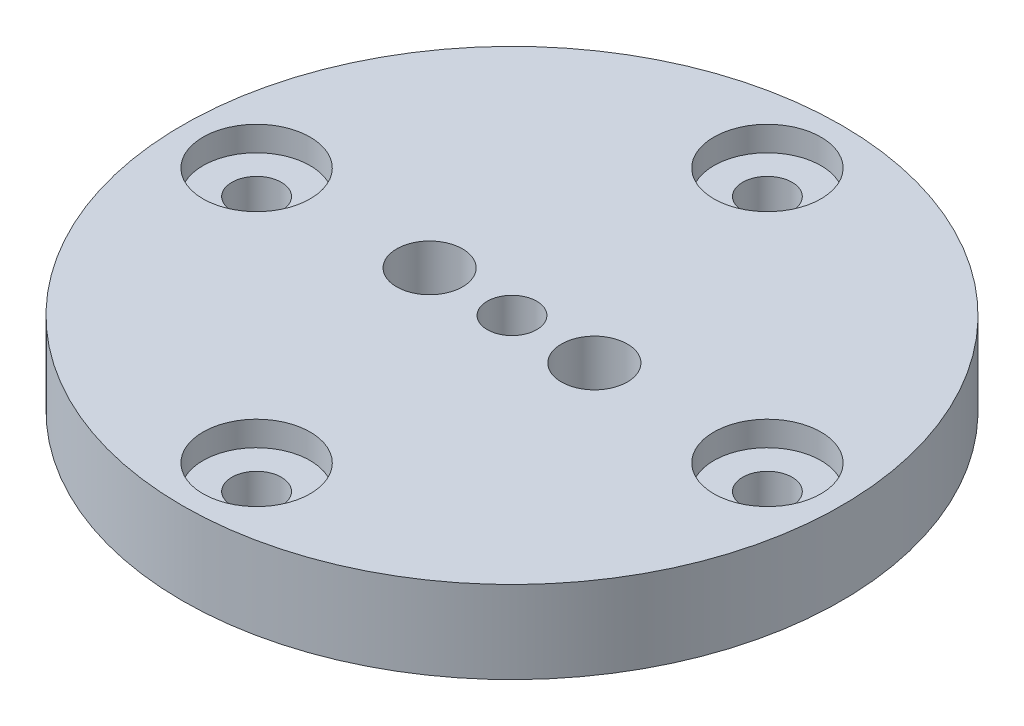
ISO-10303-21;
HEADER;
FILE_DESCRIPTION(('STEP AP214'),'2;1');
FILE_NAME('part.step','',(''),(''),'','','');
FILE_SCHEMA(('AUTOMOTIVE_DESIGN { 1 0 10303 214 1 1 1 1 }'));
ENDSEC;
DATA;
#1=APPLICATION_CONTEXT('core data for automotive mechanical design processes');
#2=APPLICATION_PROTOCOL_DEFINITION('international standard','automotive_design',2000,#1);
#3=PRODUCT_CONTEXT('',#1,'mechanical');
#4=PRODUCT('Part','Part','',(#3));
#5=PRODUCT_RELATED_PRODUCT_CATEGORY('part','',(#4));
#6=PRODUCT_DEFINITION_FORMATION('','',#4);
#7=PRODUCT_DEFINITION_CONTEXT('part definition',#1,'design');
#8=PRODUCT_DEFINITION('design','',#6,#7);
#9=PRODUCT_DEFINITION_SHAPE('','',#8);
#10=(LENGTH_UNIT() NAMED_UNIT(*) SI_UNIT(.MILLI.,.METRE.));
#11=(NAMED_UNIT(*) PLANE_ANGLE_UNIT() SI_UNIT($,.RADIAN.));
#12=(NAMED_UNIT(*) SI_UNIT($,.STERADIAN.) SOLID_ANGLE_UNIT());
#13=UNCERTAINTY_MEASURE_WITH_UNIT(LENGTH_MEASURE(1.E-05),#10,'distance_accuracy_value','');
#14=(GEOMETRIC_REPRESENTATION_CONTEXT(3) GLOBAL_UNCERTAINTY_ASSIGNED_CONTEXT((#13)) GLOBAL_UNIT_ASSIGNED_CONTEXT((#10,
#11,#12)) REPRESENTATION_CONTEXT('',''));
#15=CARTESIAN_POINT('',(0.,0.,0.));
#16=DIRECTION('',(0.,0.,1.));
#17=DIRECTION('',(1.,0.,0.));
#18=AXIS2_PLACEMENT_3D('',#15,#16,#17);
#19=CARTESIAN_POINT('',(0.,5.,-15.5));
#20=DIRECTION('',(0.,-1.,0.));
#21=DIRECTION('',(0.,0.,-1.));
#22=AXIS2_PLACEMENT_3D('',#19,#20,#21);
#23=CYLINDRICAL_SURFACE('',#22,1.5);
#24=CARTESIAN_POINT('',(0.,0.,-15.5));
#25=DIRECTION('',(0.,1.,0.));
#26=DIRECTION('',(0.,0.,1.));
#27=AXIS2_PLACEMENT_3D('',#24,#25,#26);
#28=CIRCLE('',#27,1.5);
#29=CARTESIAN_POINT('',(0.,0.,-14.));
#30=VERTEX_POINT('',#29);
#31=EDGE_CURVE('E44',#30,#30,#28,.T.);
#32=ORIENTED_EDGE('',*,*,#31,.F.);
#33=EDGE_LOOP('',(#32));
#34=FACE_BOUND('',#33,.T.);
#35=CARTESIAN_POINT('',(0.,3.5,-15.5));
#36=DIRECTION('',(0.,1.,0.));
#37=DIRECTION('',(0.,0.,1.));
#38=AXIS2_PLACEMENT_3D('',#35,#36,#37);
#39=CIRCLE('',#38,1.5);
#40=CARTESIAN_POINT('',(0.,3.5,-14.));
#41=VERTEX_POINT('',#40);
#42=EDGE_CURVE('E35',#41,#41,#39,.T.);
#43=ORIENTED_EDGE('',*,*,#42,.T.);
#44=EDGE_LOOP('',(#43));
#45=FACE_BOUND('',#44,.T.);
#46=ADVANCED_FACE('F31',(#34,#45),#23,.F.);
#47=CARTESIAN_POINT('',(15.5000000000004,5.,-4.37689192363245E-13));
#48=DIRECTION('',(0.,-1.,0.));
#49=DIRECTION('',(0.,0.,-1.));
#50=AXIS2_PLACEMENT_3D('',#47,#48,#49);
#51=CYLINDRICAL_SURFACE('',#50,1.50000000000034);
#52=CARTESIAN_POINT('',(15.5000000000004,0.,-4.37689192363245E-13));
#53=DIRECTION('',(0.,1.,0.));
#54=DIRECTION('',(0.,0.,1.));
#55=AXIS2_PLACEMENT_3D('',#52,#53,#54);
#56=CIRCLE('',#55,1.50000000000034);
#57=CARTESIAN_POINT('',(15.5000000000004,0.,1.49999999999991));
#58=VERTEX_POINT('',#57);
#59=EDGE_CURVE('E89',#58,#58,#56,.T.);
#60=ORIENTED_EDGE('',*,*,#59,.F.);
#61=EDGE_LOOP('',(#60));
#62=FACE_BOUND('',#61,.T.);
#63=CARTESIAN_POINT('',(15.5000000000004,3.5,-4.37689192363245E-13));
#64=DIRECTION('',(0.,1.,0.));
#65=DIRECTION('',(0.,0.,1.));
#66=AXIS2_PLACEMENT_3D('',#63,#64,#65);
#67=CIRCLE('',#66,1.50000000000034);
#68=CARTESIAN_POINT('',(15.5000000000004,3.5,1.49999999999991));
#69=VERTEX_POINT('',#68);
#70=EDGE_CURVE('E55',#69,#69,#67,.T.);
#71=ORIENTED_EDGE('',*,*,#70,.T.);
#72=EDGE_LOOP('',(#71));
#73=FACE_BOUND('',#72,.T.);
#74=ADVANCED_FACE('F99',(#62,#73),#51,.F.);
#75=CARTESIAN_POINT('',(8.75378384726489E-13,5.,15.5));
#76=DIRECTION('',(0.,-1.,0.));
#77=DIRECTION('',(0.,0.,-1.));
#78=AXIS2_PLACEMENT_3D('',#75,#76,#77);
#79=CYLINDRICAL_SURFACE('',#78,1.50000000000094);
#80=CARTESIAN_POINT('',(8.75378384726489E-13,0.,15.5));
#81=DIRECTION('',(0.,1.,0.));
#82=DIRECTION('',(0.,0.,1.));
#83=AXIS2_PLACEMENT_3D('',#80,#81,#82);
#84=CIRCLE('',#83,1.50000000000094);
#85=CARTESIAN_POINT('',(8.75378384726489E-13,0.,17.0000000000009));
#86=VERTEX_POINT('',#85);
#87=EDGE_CURVE('E87',#86,#86,#84,.T.);
#88=ORIENTED_EDGE('',*,*,#87,.F.);
#89=EDGE_LOOP('',(#88));
#90=FACE_BOUND('',#89,.T.);
#91=CARTESIAN_POINT('',(8.75378384726489E-13,3.5,15.5));
#92=DIRECTION('',(0.,1.,0.));
#93=DIRECTION('',(0.,0.,1.));
#94=AXIS2_PLACEMENT_3D('',#91,#92,#93);
#95=CIRCLE('',#94,1.50000000000094);
#96=CARTESIAN_POINT('',(8.75378384726489E-13,3.5,17.0000000000009));
#97=VERTEX_POINT('',#96);
#98=EDGE_CURVE('E52',#97,#97,#95,.T.);
#99=ORIENTED_EDGE('',*,*,#98,.T.);
#100=EDGE_LOOP('',(#99));
#101=FACE_BOUND('',#100,.T.);
#102=ADVANCED_FACE('F105',(#90,#101),#79,.F.);
#103=CARTESIAN_POINT('',(-15.4999999999996,5.,4.39587394901923E-13));
#104=DIRECTION('',(0.,-1.,0.));
#105=DIRECTION('',(0.,0.,-1.));
#106=AXIS2_PLACEMENT_3D('',#103,#104,#105);
#107=CYLINDRICAL_SURFACE('',#106,1.5000000000007);
#108=CARTESIAN_POINT('',(-15.4999999999996,0.,4.39587394901923E-13));
#109=DIRECTION('',(0.,1.,0.));
#110=DIRECTION('',(0.,0.,1.));
#111=AXIS2_PLACEMENT_3D('',#108,#109,#110);
#112=CIRCLE('',#111,1.5000000000007);
#113=CARTESIAN_POINT('',(-15.4999999999996,0.,1.50000000000114));
#114=VERTEX_POINT('',#113);
#115=EDGE_CURVE('E82',#114,#114,#112,.T.);
#116=ORIENTED_EDGE('',*,*,#115,.F.);
#117=EDGE_LOOP('',(#116));
#118=FACE_BOUND('',#117,.T.);
#119=CARTESIAN_POINT('',(-15.4999999999996,3.5,4.39587394901923E-13));
#120=DIRECTION('',(0.,1.,0.));
#121=DIRECTION('',(0.,0.,1.));
#122=AXIS2_PLACEMENT_3D('',#119,#120,#121);
#123=CIRCLE('',#122,1.5000000000007);
#124=CARTESIAN_POINT('',(-15.4999999999996,3.5,1.50000000000114));
#125=VERTEX_POINT('',#124);
#126=EDGE_CURVE('E49',#125,#125,#123,.T.);
#127=ORIENTED_EDGE('',*,*,#126,.T.);
#128=EDGE_LOOP('',(#127));
#129=FACE_BOUND('',#128,.T.);
#130=ADVANCED_FACE('F112',(#118,#129),#107,.F.);
#131=CARTESIAN_POINT('',(0.,5.,0.));
#132=DIRECTION('',(0.,1.,0.));
#133=DIRECTION('',(0.,0.,1.));
#134=AXIS2_PLACEMENT_3D('',#131,#132,#133);
#135=PLANE('',#134);
#136=CARTESIAN_POINT('',(0.,5.,-15.5000000000004));
#137=DIRECTION('',(0.,1.,0.));
#138=DIRECTION('',(0.,0.,1.));
#139=AXIS2_PLACEMENT_3D('',#136,#137,#138);
#140=CIRCLE('',#139,3.25);
#141=CARTESIAN_POINT('',(0.,5.,-12.2500000000004));
#142=VERTEX_POINT('',#141);
#143=EDGE_CURVE('E217',#142,#142,#140,.T.);
#144=ORIENTED_EDGE('',*,*,#143,.F.);
#145=EDGE_LOOP('',(#144));
#146=FACE_BOUND('',#145,.T.);
#147=CARTESIAN_POINT('',(15.5000000000009,5.,-4.37689192363257E-13));
#148=DIRECTION('',(0.,1.,0.));
#149=DIRECTION('',(0.,0.,1.));
#150=AXIS2_PLACEMENT_3D('',#147,#148,#149);
#151=CIRCLE('',#150,3.25000000000034);
#152=CARTESIAN_POINT('',(15.5000000000009,5.,3.2499999999999));
#153=VERTEX_POINT('',#152);
#154=EDGE_CURVE('E159',#153,#153,#151,.T.);
#155=ORIENTED_EDGE('',*,*,#154,.F.);
#156=EDGE_LOOP('',(#155));
#157=FACE_BOUND('',#156,.T.);
#158=CARTESIAN_POINT('',(8.75378384726514E-13,5.,15.5000000000004));
#159=DIRECTION('',(0.,1.,0.));
#160=DIRECTION('',(0.,0.,1.));
#161=AXIS2_PLACEMENT_3D('',#158,#159,#160);
#162=CIRCLE('',#161,3.25000000000094);
#163=CARTESIAN_POINT('',(8.75378384726514E-13,5.,18.7500000000014));
#164=VERTEX_POINT('',#163);
#165=EDGE_CURVE('E160',#164,#164,#162,.T.);
#166=ORIENTED_EDGE('',*,*,#165,.F.);
#167=EDGE_LOOP('',(#166));
#168=FACE_BOUND('',#167,.T.);
#169=CARTESIAN_POINT('',(-15.5,5.,4.39587394901935E-13));
#170=DIRECTION('',(0.,1.,0.));
#171=DIRECTION('',(0.,0.,1.));
#172=AXIS2_PLACEMENT_3D('',#169,#170,#171);
#173=CIRCLE('',#172,3.2500000000007);
#174=CARTESIAN_POINT('',(-15.5,5.,3.25000000000114));
#175=VERTEX_POINT('',#174);
#176=EDGE_CURVE('E171',#175,#175,#173,.T.);
#177=ORIENTED_EDGE('',*,*,#176,.F.);
#178=EDGE_LOOP('',(#177));
#179=FACE_BOUND('',#178,.T.);
#180=CARTESIAN_POINT('',(5.,5.,0.));
#181=DIRECTION('',(0.,1.,0.));
#182=DIRECTION('',(0.,0.,1.));
#183=AXIS2_PLACEMENT_3D('',#180,#181,#182);
#184=CIRCLE('',#183,2.);
#185=CARTESIAN_POINT('',(5.,5.,2.));
#186=VERTEX_POINT('',#185);
#187=EDGE_CURVE('E73',#186,#186,#184,.T.);
#188=ORIENTED_EDGE('',*,*,#187,.F.);
#189=EDGE_LOOP('',(#188));
#190=FACE_BOUND('',#189,.T.);
#191=CARTESIAN_POINT('',(0.,5.,0.));
#192=DIRECTION('',(0.,1.,0.));
#193=DIRECTION('',(0.,0.,1.));
#194=AXIS2_PLACEMENT_3D('',#191,#192,#193);
#195=CIRCLE('',#194,20.);
#196=CARTESIAN_POINT('',(0.,5.,20.));
#197=VERTEX_POINT('',#196);
#198=EDGE_CURVE('E10',#197,#197,#195,.T.);
#199=ORIENTED_EDGE('',*,*,#198,.T.);
#200=EDGE_LOOP('',(#199));
#201=FACE_BOUND('',#200,.T.);
#202=CARTESIAN_POINT('',(-5.,5.,0.));
#203=DIRECTION('',(0.,1.,0.));
#204=DIRECTION('',(0.,0.,1.));
#205=AXIS2_PLACEMENT_3D('',#202,#203,#204);
#206=CIRCLE('',#205,2.);
#207=CARTESIAN_POINT('',(-5.,5.,2.));
#208=VERTEX_POINT('',#207);
#209=EDGE_CURVE('E79',#208,#208,#206,.T.);
#210=ORIENTED_EDGE('',*,*,#209,.F.);
#211=EDGE_LOOP('',(#210));
#212=FACE_BOUND('',#211,.T.);
#213=CARTESIAN_POINT('',(0.,5.,0.));
#214=DIRECTION('',(0.,1.,0.));
#215=DIRECTION('',(0.,0.,1.));
#216=AXIS2_PLACEMENT_3D('',#213,#214,#215);
#217=CIRCLE('',#216,1.5);
#218=CARTESIAN_POINT('',(0.,5.,1.5));
#219=VERTEX_POINT('',#218);
#220=EDGE_CURVE('E64',#219,#219,#217,.T.);
#221=ORIENTED_EDGE('',*,*,#220,.F.);
#222=EDGE_LOOP('',(#221));
#223=FACE_BOUND('',#222,.T.);
#224=ADVANCED_FACE('F110',(#146,#157,#168,#179,#190,#201,#212,#223),#135,.T.);
#225=CARTESIAN_POINT('',(0.,0.,0.));
#226=DIRECTION('',(0.,1.,0.));
#227=DIRECTION('',(0.,0.,1.));
#228=AXIS2_PLACEMENT_3D('',#225,#226,#227);
#229=PLANE('',#228);
#230=CARTESIAN_POINT('',(0.,0.,0.));
#231=DIRECTION('',(0.,1.,0.));
#232=DIRECTION('',(0.,0.,1.));
#233=AXIS2_PLACEMENT_3D('',#230,#231,#232);
#234=CIRCLE('',#233,20.);
#235=CARTESIAN_POINT('',(0.,0.,20.));
#236=VERTEX_POINT('',#235);
#237=EDGE_CURVE('E39',#236,#236,#234,.T.);
#238=ORIENTED_EDGE('',*,*,#237,.F.);
#239=EDGE_LOOP('',(#238));
#240=FACE_BOUND('',#239,.T.);
#241=ORIENTED_EDGE('',*,*,#31,.T.);
#242=EDGE_LOOP('',(#241));
#243=FACE_BOUND('',#242,.T.);
#244=ORIENTED_EDGE('',*,*,#59,.T.);
#245=EDGE_LOOP('',(#244));
#246=FACE_BOUND('',#245,.T.);
#247=ORIENTED_EDGE('',*,*,#87,.T.);
#248=EDGE_LOOP('',(#247));
#249=FACE_BOUND('',#248,.T.);
#250=ORIENTED_EDGE('',*,*,#115,.T.);
#251=EDGE_LOOP('',(#250));
#252=FACE_BOUND('',#251,.T.);
#253=CARTESIAN_POINT('',(-5.,0.,0.));
#254=DIRECTION('',(0.,1.,0.));
#255=DIRECTION('',(0.,0.,1.));
#256=AXIS2_PLACEMENT_3D('',#253,#254,#255);
#257=CIRCLE('',#256,2.);
#258=CARTESIAN_POINT('',(-5.,0.,2.));
#259=VERTEX_POINT('',#258);
#260=EDGE_CURVE('E76',#259,#259,#257,.T.);
#261=ORIENTED_EDGE('',*,*,#260,.T.);
#262=EDGE_LOOP('',(#261));
#263=FACE_BOUND('',#262,.T.);
#264=CARTESIAN_POINT('',(5.,0.,0.));
#265=DIRECTION('',(0.,1.,0.));
#266=DIRECTION('',(0.,0.,1.));
#267=AXIS2_PLACEMENT_3D('',#264,#265,#266);
#268=CIRCLE('',#267,2.);
#269=CARTESIAN_POINT('',(5.,0.,2.));
#270=VERTEX_POINT('',#269);
#271=EDGE_CURVE('E69',#270,#270,#268,.T.);
#272=ORIENTED_EDGE('',*,*,#271,.T.);
#273=EDGE_LOOP('',(#272));
#274=FACE_BOUND('',#273,.T.);
#275=CARTESIAN_POINT('',(0.,0.,0.));
#276=DIRECTION('',(0.,1.,0.));
#277=DIRECTION('',(0.,0.,1.));
#278=AXIS2_PLACEMENT_3D('',#275,#276,#277);
#279=CIRCLE('',#278,1.5);
#280=CARTESIAN_POINT('',(0.,0.,1.5));
#281=VERTEX_POINT('',#280);
#282=EDGE_CURVE('E60',#281,#281,#279,.T.);
#283=ORIENTED_EDGE('',*,*,#282,.T.);
#284=EDGE_LOOP('',(#283));
#285=FACE_BOUND('',#284,.T.);
#286=ADVANCED_FACE('F96',(#240,#243,#246,#249,#252,#263,#274,#285),#229,.F.);
#287=CARTESIAN_POINT('',(0.,5.,0.));
#288=DIRECTION('',(0.,-1.,0.));
#289=DIRECTION('',(0.,0.,-1.));
#290=AXIS2_PLACEMENT_3D('',#287,#288,#289);
#291=CYLINDRICAL_SURFACE('',#290,20.);
#292=ORIENTED_EDGE('',*,*,#198,.F.);
#293=EDGE_LOOP('',(#292));
#294=FACE_BOUND('',#293,.T.);
#295=ORIENTED_EDGE('',*,*,#237,.T.);
#296=EDGE_LOOP('',(#295));
#297=FACE_BOUND('',#296,.T.);
#298=ADVANCED_FACE('F33',(#294,#297),#291,.T.);
#299=CARTESIAN_POINT('',(-5.,5.,0.));
#300=DIRECTION('',(0.,-1.,0.));
#301=DIRECTION('',(0.,0.,-1.));
#302=AXIS2_PLACEMENT_3D('',#299,#300,#301);
#303=CYLINDRICAL_SURFACE('',#302,2.);
#304=ORIENTED_EDGE('',*,*,#209,.T.);
#305=EDGE_LOOP('',(#304));
#306=FACE_BOUND('',#305,.T.);
#307=ORIENTED_EDGE('',*,*,#260,.F.);
#308=EDGE_LOOP('',(#307));
#309=FACE_BOUND('',#308,.T.);
#310=ADVANCED_FACE('F120',(#306,#309),#303,.F.);
#311=CARTESIAN_POINT('',(5.,5.,0.));
#312=DIRECTION('',(0.,-1.,0.));
#313=DIRECTION('',(0.,0.,-1.));
#314=AXIS2_PLACEMENT_3D('',#311,#312,#313);
#315=CYLINDRICAL_SURFACE('',#314,2.);
#316=ORIENTED_EDGE('',*,*,#187,.T.);
#317=EDGE_LOOP('',(#316));
#318=FACE_BOUND('',#317,.T.);
#319=ORIENTED_EDGE('',*,*,#271,.F.);
#320=EDGE_LOOP('',(#319));
#321=FACE_BOUND('',#320,.T.);
#322=ADVANCED_FACE('F127',(#318,#321),#315,.F.);
#323=CARTESIAN_POINT('',(0.,5.,0.));
#324=DIRECTION('',(0.,-1.,0.));
#325=DIRECTION('',(0.,0.,-1.));
#326=AXIS2_PLACEMENT_3D('',#323,#324,#325);
#327=CYLINDRICAL_SURFACE('',#326,1.5);
#328=ORIENTED_EDGE('',*,*,#220,.T.);
#329=EDGE_LOOP('',(#328));
#330=FACE_BOUND('',#329,.T.);
#331=ORIENTED_EDGE('',*,*,#282,.F.);
#332=EDGE_LOOP('',(#331));
#333=FACE_BOUND('',#332,.T.);
#334=ADVANCED_FACE('F133',(#330,#333),#327,.F.);
#335=CARTESIAN_POINT('',(-15.5,3.5,4.39587394901935E-13));
#336=DIRECTION('',(0.,1.,0.));
#337=DIRECTION('',(0.,0.,1.));
#338=AXIS2_PLACEMENT_3D('',#335,#336,#337);
#339=CYLINDRICAL_SURFACE('',#338,3.2500000000007);
#340=CARTESIAN_POINT('',(-15.5,3.5,4.39587394901935E-13));
#341=DIRECTION('',(0.,1.,0.));
#342=DIRECTION('',(0.,0.,1.));
#343=AXIS2_PLACEMENT_3D('',#340,#341,#342);
#344=CIRCLE('',#343,3.2500000000007);
#345=CARTESIAN_POINT('',(-15.5,3.5,3.25000000000114));
#346=VERTEX_POINT('',#345);
#347=EDGE_CURVE('E166',#346,#346,#344,.T.);
#348=ORIENTED_EDGE('',*,*,#347,.F.);
#349=EDGE_LOOP('',(#348));
#350=FACE_BOUND('',#349,.T.);
#351=ORIENTED_EDGE('',*,*,#176,.T.);
#352=EDGE_LOOP('',(#351));
#353=FACE_BOUND('',#352,.T.);
#354=ADVANCED_FACE('F175',(#350,#353),#339,.F.);
#355=CARTESIAN_POINT('',(-15.5,3.5,4.39587394901935E-13));
#356=DIRECTION('',(0.,1.,0.));
#357=DIRECTION('',(0.,0.,1.));
#358=AXIS2_PLACEMENT_3D('',#355,#356,#357);
#359=PLANE('',#358);
#360=ORIENTED_EDGE('',*,*,#126,.F.);
#361=EDGE_LOOP('',(#360));
#362=FACE_BOUND('',#361,.T.);
#363=ORIENTED_EDGE('',*,*,#347,.T.);
#364=EDGE_LOOP('',(#363));
#365=FACE_BOUND('',#364,.T.);
#366=ADVANCED_FACE('F189',(#362,#365),#359,.T.);
#367=CARTESIAN_POINT('',(8.75378384726514E-13,3.5,15.5000000000004));
#368=DIRECTION('',(0.,1.,0.));
#369=DIRECTION('',(0.,0.,1.));
#370=AXIS2_PLACEMENT_3D('',#367,#368,#369);
#371=CYLINDRICAL_SURFACE('',#370,3.25000000000094);
#372=CARTESIAN_POINT('',(8.75378384726514E-13,3.5,15.5000000000004));
#373=DIRECTION('',(0.,1.,0.));
#374=DIRECTION('',(0.,0.,1.));
#375=AXIS2_PLACEMENT_3D('',#372,#373,#374);
#376=CIRCLE('',#375,3.25000000000094);
#377=CARTESIAN_POINT('',(8.75378384726514E-13,3.5,18.7500000000014));
#378=VERTEX_POINT('',#377);
#379=EDGE_CURVE('E157',#378,#378,#376,.T.);
#380=ORIENTED_EDGE('',*,*,#379,.F.);
#381=EDGE_LOOP('',(#380));
#382=FACE_BOUND('',#381,.T.);
#383=ORIENTED_EDGE('',*,*,#165,.T.);
#384=EDGE_LOOP('',(#383));
#385=FACE_BOUND('',#384,.T.);
#386=ADVANCED_FACE('F153',(#382,#385),#371,.F.);
#387=CARTESIAN_POINT('',(8.75378384726514E-13,3.5,15.5000000000004));
#388=DIRECTION('',(0.,1.,0.));
#389=DIRECTION('',(0.,0.,1.));
#390=AXIS2_PLACEMENT_3D('',#387,#388,#389);
#391=PLANE('',#390);
#392=ORIENTED_EDGE('',*,*,#98,.F.);
#393=EDGE_LOOP('',(#392));
#394=FACE_BOUND('',#393,.T.);
#395=ORIENTED_EDGE('',*,*,#379,.T.);
#396=EDGE_LOOP('',(#395));
#397=FACE_BOUND('',#396,.T.);
#398=ADVANCED_FACE('F149',(#394,#397),#391,.T.);
#399=CARTESIAN_POINT('',(15.5000000000009,3.5,-4.37689192363257E-13));
#400=DIRECTION('',(0.,1.,0.));
#401=DIRECTION('',(0.,0.,1.));
#402=AXIS2_PLACEMENT_3D('',#399,#400,#401);
#403=CYLINDRICAL_SURFACE('',#402,3.25000000000034);
#404=CARTESIAN_POINT('',(15.5000000000009,3.5,-4.37689192363257E-13));
#405=DIRECTION('',(0.,1.,0.));
#406=DIRECTION('',(0.,0.,1.));
#407=AXIS2_PLACEMENT_3D('',#404,#405,#406);
#408=CIRCLE('',#407,3.25000000000034);
#409=CARTESIAN_POINT('',(15.5000000000009,3.5,3.2499999999999));
#410=VERTEX_POINT('',#409);
#411=EDGE_CURVE('E163',#410,#410,#408,.T.);
#412=ORIENTED_EDGE('',*,*,#411,.F.);
#413=EDGE_LOOP('',(#412));
#414=FACE_BOUND('',#413,.T.);
#415=ORIENTED_EDGE('',*,*,#154,.T.);
#416=EDGE_LOOP('',(#415));
#417=FACE_BOUND('',#416,.T.);
#418=ADVANCED_FACE('F152',(#414,#417),#403,.F.);
#419=CARTESIAN_POINT('',(15.5000000000009,3.5,-4.37689192363257E-13));
#420=DIRECTION('',(0.,1.,0.));
#421=DIRECTION('',(0.,0.,1.));
#422=AXIS2_PLACEMENT_3D('',#419,#420,#421);
#423=PLANE('',#422);
#424=ORIENTED_EDGE('',*,*,#70,.F.);
#425=EDGE_LOOP('',(#424));
#426=FACE_BOUND('',#425,.T.);
#427=ORIENTED_EDGE('',*,*,#411,.T.);
#428=EDGE_LOOP('',(#427));
#429=FACE_BOUND('',#428,.T.);
#430=ADVANCED_FACE('F200',(#426,#429),#423,.T.);
#431=CARTESIAN_POINT('',(0.,3.5,-15.5000000000004));
#432=DIRECTION('',(0.,1.,0.));
#433=DIRECTION('',(0.,0.,1.));
#434=AXIS2_PLACEMENT_3D('',#431,#432,#433);
#435=CYLINDRICAL_SURFACE('',#434,3.25);
#436=CARTESIAN_POINT('',(0.,3.5,-15.5000000000004));
#437=DIRECTION('',(0.,1.,0.));
#438=DIRECTION('',(0.,0.,1.));
#439=AXIS2_PLACEMENT_3D('',#436,#437,#438);
#440=CIRCLE('',#439,3.25);
#441=CARTESIAN_POINT('',(0.,3.5,-12.2500000000004));
#442=VERTEX_POINT('',#441);
#443=EDGE_CURVE('E53',#442,#442,#440,.T.);
#444=ORIENTED_EDGE('',*,*,#443,.F.);
#445=EDGE_LOOP('',(#444));
#446=FACE_BOUND('',#445,.T.);
#447=ORIENTED_EDGE('',*,*,#143,.T.);
#448=EDGE_LOOP('',(#447));
#449=FACE_BOUND('',#448,.T.);
#450=ADVANCED_FACE('F204',(#446,#449),#435,.F.);
#451=CARTESIAN_POINT('',(0.,3.5,-15.5000000000004));
#452=DIRECTION('',(0.,1.,0.));
#453=DIRECTION('',(0.,0.,1.));
#454=AXIS2_PLACEMENT_3D('',#451,#452,#453);
#455=PLANE('',#454);
#456=ORIENTED_EDGE('',*,*,#42,.F.);
#457=EDGE_LOOP('',(#456));
#458=FACE_BOUND('',#457,.T.);
#459=ORIENTED_EDGE('',*,*,#443,.T.);
#460=EDGE_LOOP('',(#459));
#461=FACE_BOUND('',#460,.T.);
#462=ADVANCED_FACE('F208',(#458,#461),#455,.T.);
#463=CLOSED_SHELL('',(#46,#74,#102,#130,#224,#286,#298,#310,#322,#334,#354,#366,#386,#398,#418,
#430,#450,#462));
#464=MANIFOLD_SOLID_BREP('B2',#463);
#465=ADVANCED_BREP_SHAPE_REPRESENTATION('',(#18,#464),#14);
#466=SHAPE_DEFINITION_REPRESENTATION(#9,#465);
ENDSEC;
END-ISO-10303-21;
